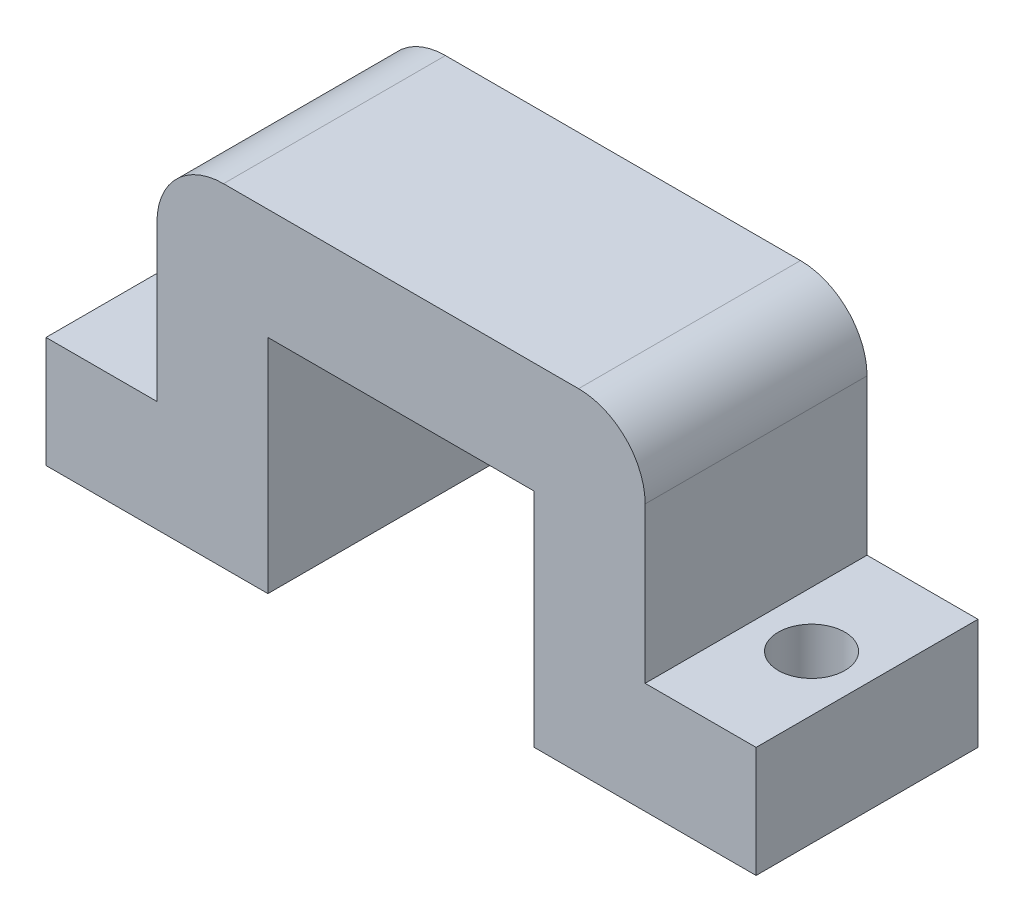
ISO-10303-21;
HEADER;
FILE_DESCRIPTION(('STEP AP214'),'2;1');
FILE_NAME('part.step','',(''),(''),'','','');
FILE_SCHEMA(('AUTOMOTIVE_DESIGN { 1 0 10303 214 1 1 1 1 }'));
ENDSEC;
DATA;
#1=APPLICATION_CONTEXT('core data for automotive mechanical design processes');
#2=APPLICATION_PROTOCOL_DEFINITION('international standard','automotive_design',2000,#1);
#3=PRODUCT_CONTEXT('',#1,'mechanical');
#4=PRODUCT('Part','Part','',(#3));
#5=PRODUCT_RELATED_PRODUCT_CATEGORY('part','',(#4));
#6=PRODUCT_DEFINITION_FORMATION('','',#4);
#7=PRODUCT_DEFINITION_CONTEXT('part definition',#1,'design');
#8=PRODUCT_DEFINITION('design','',#6,#7);
#9=PRODUCT_DEFINITION_SHAPE('','',#8);
#10=(LENGTH_UNIT() NAMED_UNIT(*) SI_UNIT(.MILLI.,.METRE.));
#11=(NAMED_UNIT(*) PLANE_ANGLE_UNIT() SI_UNIT($,.RADIAN.));
#12=(NAMED_UNIT(*) SI_UNIT($,.STERADIAN.) SOLID_ANGLE_UNIT());
#13=UNCERTAINTY_MEASURE_WITH_UNIT(LENGTH_MEASURE(1.E-05),#10,'distance_accuracy_value','');
#14=(GEOMETRIC_REPRESENTATION_CONTEXT(3) GLOBAL_UNCERTAINTY_ASSIGNED_CONTEXT((#13)) GLOBAL_UNIT_ASSIGNED_CONTEXT((#10,
#11,#12)) REPRESENTATION_CONTEXT('',''));
#15=CARTESIAN_POINT('',(0.,0.,0.));
#16=DIRECTION('',(0.,0.,1.));
#17=DIRECTION('',(1.,0.,0.));
#18=AXIS2_PLACEMENT_3D('',#15,#16,#17);
#19=CARTESIAN_POINT('',(0.,1.37362637362637,10.));
#20=DIRECTION('',(0.,1.,0.));
#21=DIRECTION('',(-1.,0.,0.));
#22=AXIS2_PLACEMENT_3D('',#19,#20,#21);
#23=PLANE('',#22);
#24=CARTESIAN_POINT('',(-7.5,1.37362637362637,5.));
#25=DIRECTION('',(0.,1.,0.));
#26=DIRECTION('',(-1.,0.,0.));
#27=AXIS2_PLACEMENT_3D('',#24,#25,#26);
#28=CIRCLE('',#27,1.5);
#29=CARTESIAN_POINT('',(-9.,1.37362637362637,5.));
#30=VERTEX_POINT('',#29);
#31=EDGE_CURVE('E294',#30,#30,#28,.T.);
#32=ORIENTED_EDGE('',*,*,#31,.T.);
#33=EDGE_LOOP('',(#32));
#34=FACE_BOUND('',#33,.T.);
#35=DIRECTION('',(1.,0.,0.));
#36=VECTOR('',#35,1.);
#37=CARTESIAN_POINT('',(0.,1.37362637362637,0.));
#38=LINE('',#37,#36);
#39=CARTESIAN_POINT('',(-10.,1.37362637362637,0.));
#40=VERTEX_POINT('',#39);
#41=CARTESIAN_POINT('',(0.,1.37362637362637,0.));
#42=VERTEX_POINT('',#41);
#43=EDGE_CURVE('E171',#40,#42,#38,.T.);
#44=ORIENTED_EDGE('',*,*,#43,.T.);
#45=DIRECTION('',(0.,0.,-1.));
#46=VECTOR('',#45,1.);
#47=CARTESIAN_POINT('',(0.,1.37362637362637,10.));
#48=LINE('',#47,#46);
#49=CARTESIAN_POINT('',(0.,1.37362637362637,10.));
#50=VERTEX_POINT('',#49);
#51=EDGE_CURVE('E11',#50,#42,#48,.T.);
#52=ORIENTED_EDGE('',*,*,#51,.F.);
#53=DIRECTION('',(1.,0.,0.));
#54=VECTOR('',#53,1.);
#55=CARTESIAN_POINT('',(0.,1.37362637362637,10.));
#56=LINE('',#55,#54);
#57=CARTESIAN_POINT('',(-10.,1.37362637362637,10.));
#58=VERTEX_POINT('',#57);
#59=EDGE_CURVE('E198',#58,#50,#56,.T.);
#60=ORIENTED_EDGE('',*,*,#59,.F.);
#61=DIRECTION('',(0.,0.,-1.));
#62=VECTOR('',#61,1.);
#63=CARTESIAN_POINT('',(-10.,1.37362637362637,10.));
#64=LINE('',#63,#62);
#65=EDGE_CURVE('E167',#58,#40,#64,.T.);
#66=ORIENTED_EDGE('',*,*,#65,.T.);
#67=EDGE_LOOP('',(#44,#52,#60,#66));
#68=FACE_BOUND('',#67,.T.);
#69=ADVANCED_FACE('F39',(#34,#68),#23,.F.);
#70=CARTESIAN_POINT('',(0.,1.37362637362637,10.));
#71=DIRECTION('',(-1.,0.,0.));
#72=DIRECTION('',(0.,0.,1.));
#73=AXIS2_PLACEMENT_3D('',#70,#71,#72);
#74=PLANE('',#73);
#75=DIRECTION('',(0.,1.,0.));
#76=VECTOR('',#75,1.);
#77=CARTESIAN_POINT('',(0.,1.37362637362637,0.));
#78=LINE('',#77,#76);
#79=CARTESIAN_POINT('',(0.,11.3736263736264,0.));
#80=VERTEX_POINT('',#79);
#81=EDGE_CURVE('E174',#42,#80,#78,.T.);
#82=ORIENTED_EDGE('',*,*,#81,.T.);
#83=DIRECTION('',(0.,0.,-1.));
#84=VECTOR('',#83,1.);
#85=CARTESIAN_POINT('',(0.,11.3736263736264,10.));
#86=LINE('',#85,#84);
#87=CARTESIAN_POINT('',(0.,11.3736263736264,10.));
#88=VERTEX_POINT('',#87);
#89=EDGE_CURVE('E47',#88,#80,#86,.T.);
#90=ORIENTED_EDGE('',*,*,#89,.F.);
#91=DIRECTION('',(0.,1.,0.));
#92=VECTOR('',#91,1.);
#93=CARTESIAN_POINT('',(0.,1.37362637362637,10.));
#94=LINE('',#93,#92);
#95=EDGE_CURVE('E116',#50,#88,#94,.T.);
#96=ORIENTED_EDGE('',*,*,#95,.F.);
#97=ORIENTED_EDGE('',*,*,#51,.T.);
#98=EDGE_LOOP('',(#82,#90,#96,#97));
#99=FACE_BOUND('',#98,.T.);
#100=ADVANCED_FACE('F287',(#99),#74,.F.);
#101=CARTESIAN_POINT('',(0.,11.3736263736264,10.));
#102=DIRECTION('',(0.,1.,0.));
#103=DIRECTION('',(0.,0.,1.));
#104=AXIS2_PLACEMENT_3D('',#101,#102,#103);
#105=PLANE('',#104);
#106=DIRECTION('',(1.,0.,0.));
#107=VECTOR('',#106,1.);
#108=CARTESIAN_POINT('',(0.,11.3736263736264,0.));
#109=LINE('',#108,#107);
#110=CARTESIAN_POINT('',(12.,11.3736263736264,0.));
#111=VERTEX_POINT('',#110);
#112=EDGE_CURVE('E177',#80,#111,#109,.T.);
#113=ORIENTED_EDGE('',*,*,#112,.T.);
#114=DIRECTION('',(0.,0.,-1.));
#115=VECTOR('',#114,1.);
#116=CARTESIAN_POINT('',(12.,11.3736263736264,10.));
#117=LINE('',#116,#115);
#118=CARTESIAN_POINT('',(12.,11.3736263736264,10.));
#119=VERTEX_POINT('',#118);
#120=EDGE_CURVE('E223',#119,#111,#117,.T.);
#121=ORIENTED_EDGE('',*,*,#120,.F.);
#122=DIRECTION('',(1.,0.,0.));
#123=VECTOR('',#122,1.);
#124=CARTESIAN_POINT('',(0.,11.3736263736264,10.));
#125=LINE('',#124,#123);
#126=EDGE_CURVE('E231',#88,#119,#125,.T.);
#127=ORIENTED_EDGE('',*,*,#126,.F.);
#128=ORIENTED_EDGE('',*,*,#89,.T.);
#129=EDGE_LOOP('',(#113,#121,#127,#128));
#130=FACE_BOUND('',#129,.T.);
#131=ADVANCED_FACE('F229',(#130),#105,.F.);
#132=CARTESIAN_POINT('',(12.,11.3736263736264,10.));
#133=DIRECTION('',(1.,0.,0.));
#134=DIRECTION('',(0.,1.,0.));
#135=AXIS2_PLACEMENT_3D('',#132,#133,#134);
#136=PLANE('',#135);
#137=DIRECTION('',(0.,-1.,0.));
#138=VECTOR('',#137,1.);
#139=CARTESIAN_POINT('',(12.,11.3736263736264,0.));
#140=LINE('',#139,#138);
#141=CARTESIAN_POINT('',(12.,1.37362637362637,0.));
#142=VERTEX_POINT('',#141);
#143=EDGE_CURVE('E179',#111,#142,#140,.T.);
#144=ORIENTED_EDGE('',*,*,#143,.T.);
#145=DIRECTION('',(0.,0.,-1.));
#146=VECTOR('',#145,1.);
#147=CARTESIAN_POINT('',(12.,1.37362637362637,10.));
#148=LINE('',#147,#146);
#149=CARTESIAN_POINT('',(12.,1.37362637362637,10.));
#150=VERTEX_POINT('',#149);
#151=EDGE_CURVE('E220',#150,#142,#148,.T.);
#152=ORIENTED_EDGE('',*,*,#151,.F.);
#153=DIRECTION('',(0.,-1.,0.));
#154=VECTOR('',#153,1.);
#155=CARTESIAN_POINT('',(12.,11.3736263736264,10.));
#156=LINE('',#155,#154);
#157=EDGE_CURVE('E249',#119,#150,#156,.T.);
#158=ORIENTED_EDGE('',*,*,#157,.F.);
#159=ORIENTED_EDGE('',*,*,#120,.T.);
#160=EDGE_LOOP('',(#144,#152,#158,#159));
#161=FACE_BOUND('',#160,.T.);
#162=ADVANCED_FACE('F240',(#161),#136,.F.);
#163=CARTESIAN_POINT('',(12.,1.37362637362637,10.));
#164=DIRECTION('',(0.,1.,0.));
#165=DIRECTION('',(0.,0.,1.));
#166=AXIS2_PLACEMENT_3D('',#163,#164,#165);
#167=PLANE('',#166);
#168=CARTESIAN_POINT('',(19.5,1.37362637362637,5.));
#169=DIRECTION('',(0.,1.,0.));
#170=DIRECTION('',(0.,0.,1.));
#171=AXIS2_PLACEMENT_3D('',#168,#169,#170);
#172=CIRCLE('',#171,1.5);
#173=CARTESIAN_POINT('',(19.5,1.37362637362637,6.5));
#174=VERTEX_POINT('',#173);
#175=EDGE_CURVE('E175',#174,#174,#172,.F.);
#176=ORIENTED_EDGE('',*,*,#175,.F.);
#177=EDGE_LOOP('',(#176));
#178=FACE_BOUND('',#177,.T.);
#179=DIRECTION('',(1.,0.,0.));
#180=VECTOR('',#179,1.);
#181=CARTESIAN_POINT('',(12.,1.37362637362637,0.));
#182=LINE('',#181,#180);
#183=CARTESIAN_POINT('',(22.,1.37362637362637,0.));
#184=VERTEX_POINT('',#183);
#185=EDGE_CURVE('E181',#142,#184,#182,.T.);
#186=ORIENTED_EDGE('',*,*,#185,.T.);
#187=DIRECTION('',(0.,0.,-1.));
#188=VECTOR('',#187,1.);
#189=CARTESIAN_POINT('',(22.,1.37362637362637,10.));
#190=LINE('',#189,#188);
#191=CARTESIAN_POINT('',(22.,1.37362637362637,10.));
#192=VERTEX_POINT('',#191);
#193=EDGE_CURVE('E217',#192,#184,#190,.T.);
#194=ORIENTED_EDGE('',*,*,#193,.F.);
#195=DIRECTION('',(1.,0.,0.));
#196=VECTOR('',#195,1.);
#197=CARTESIAN_POINT('',(12.,1.37362637362637,10.));
#198=LINE('',#197,#196);
#199=EDGE_CURVE('E246',#150,#192,#198,.T.);
#200=ORIENTED_EDGE('',*,*,#199,.F.);
#201=ORIENTED_EDGE('',*,*,#151,.T.);
#202=EDGE_LOOP('',(#186,#194,#200,#201));
#203=FACE_BOUND('',#202,.T.);
#204=ADVANCED_FACE('F244',(#178,#203),#167,.F.);
#205=CARTESIAN_POINT('',(22.,6.37362637362637,10.));
#206=DIRECTION('',(-1.,0.,0.));
#207=DIRECTION('',(0.,0.,1.));
#208=AXIS2_PLACEMENT_3D('',#205,#206,#207);
#209=PLANE('',#208);
#210=DIRECTION('',(0.,1.,0.));
#211=VECTOR('',#210,1.);
#212=CARTESIAN_POINT('',(22.,6.37362637362637,0.));
#213=LINE('',#212,#211);
#214=CARTESIAN_POINT('',(22.,6.37362637362637,0.));
#215=VERTEX_POINT('',#214);
#216=EDGE_CURVE('E183',#184,#215,#213,.T.);
#217=ORIENTED_EDGE('',*,*,#216,.T.);
#218=DIRECTION('',(0.,0.,-1.));
#219=VECTOR('',#218,1.);
#220=CARTESIAN_POINT('',(22.,6.37362637362637,10.));
#221=LINE('',#220,#219);
#222=CARTESIAN_POINT('',(22.,6.37362637362637,10.));
#223=VERTEX_POINT('',#222);
#224=EDGE_CURVE('E214',#223,#215,#221,.T.);
#225=ORIENTED_EDGE('',*,*,#224,.F.);
#226=DIRECTION('',(0.,1.,0.));
#227=VECTOR('',#226,1.);
#228=CARTESIAN_POINT('',(22.,6.37362637362637,10.));
#229=LINE('',#228,#227);
#230=EDGE_CURVE('E248',#192,#223,#229,.T.);
#231=ORIENTED_EDGE('',*,*,#230,.F.);
#232=ORIENTED_EDGE('',*,*,#193,.T.);
#233=EDGE_LOOP('',(#217,#225,#231,#232));
#234=FACE_BOUND('',#233,.T.);
#235=ADVANCED_FACE('F320',(#234),#209,.F.);
#236=CARTESIAN_POINT('',(17.,6.37362637362637,10.));
#237=DIRECTION('',(0.,-1.,0.));
#238=DIRECTION('',(0.,0.,-1.));
#239=AXIS2_PLACEMENT_3D('',#236,#237,#238);
#240=PLANE('',#239);
#241=CARTESIAN_POINT('',(19.5,6.37362637362637,5.));
#242=DIRECTION('',(0.,1.,0.));
#243=DIRECTION('',(0.,0.,1.));
#244=AXIS2_PLACEMENT_3D('',#241,#242,#243);
#245=CIRCLE('',#244,1.5);
#246=CARTESIAN_POINT('',(19.5,6.37362637362637,6.5));
#247=VERTEX_POINT('',#246);
#248=EDGE_CURVE('E301',#247,#247,#245,.F.);
#249=ORIENTED_EDGE('',*,*,#248,.T.);
#250=EDGE_LOOP('',(#249));
#251=FACE_BOUND('',#250,.T.);
#252=DIRECTION('',(-1.,0.,0.));
#253=VECTOR('',#252,1.);
#254=CARTESIAN_POINT('',(17.,6.37362637362637,0.));
#255=LINE('',#254,#253);
#256=CARTESIAN_POINT('',(17.,6.37362637362637,0.));
#257=VERTEX_POINT('',#256);
#258=EDGE_CURVE('E185',#215,#257,#255,.T.);
#259=ORIENTED_EDGE('',*,*,#258,.T.);
#260=DIRECTION('',(0.,0.,-1.));
#261=VECTOR('',#260,1.);
#262=CARTESIAN_POINT('',(17.,6.37362637362637,10.));
#263=LINE('',#262,#261);
#264=CARTESIAN_POINT('',(17.,6.37362637362637,10.));
#265=VERTEX_POINT('',#264);
#266=EDGE_CURVE('E211',#265,#257,#263,.T.);
#267=ORIENTED_EDGE('',*,*,#266,.F.);
#268=DIRECTION('',(-1.,0.,0.));
#269=VECTOR('',#268,1.);
#270=CARTESIAN_POINT('',(17.,6.37362637362637,10.));
#271=LINE('',#270,#269);
#272=EDGE_CURVE('E251',#223,#265,#271,.T.);
#273=ORIENTED_EDGE('',*,*,#272,.F.);
#274=ORIENTED_EDGE('',*,*,#224,.T.);
#275=EDGE_LOOP('',(#259,#267,#273,#274));
#276=FACE_BOUND('',#275,.T.);
#277=ADVANCED_FACE('F309',(#251,#276),#240,.F.);
#278=CARTESIAN_POINT('',(17.,13.3736263736264,10.));
#279=DIRECTION('',(-1.,0.,0.));
#280=DIRECTION('',(0.,0.,1.));
#281=AXIS2_PLACEMENT_3D('',#278,#279,#280);
#282=PLANE('',#281);
#283=DIRECTION('',(0.,1.,0.));
#284=VECTOR('',#283,1.);
#285=CARTESIAN_POINT('',(17.,13.3736263736264,0.));
#286=LINE('',#285,#284);
#287=CARTESIAN_POINT('',(17.,13.3736263736264,0.));
#288=VERTEX_POINT('',#287);
#289=EDGE_CURVE('E187',#257,#288,#286,.T.);
#290=ORIENTED_EDGE('',*,*,#289,.T.);
#291=DIRECTION('',(0.,0.,-1.));
#292=VECTOR('',#291,1.);
#293=CARTESIAN_POINT('',(17.,13.3736263736264,10.));
#294=LINE('',#293,#292);
#295=CARTESIAN_POINT('',(17.,13.3736263736264,10.));
#296=VERTEX_POINT('',#295);
#297=EDGE_CURVE('E208',#296,#288,#294,.T.);
#298=ORIENTED_EDGE('',*,*,#297,.F.);
#299=DIRECTION('',(0.,1.,0.));
#300=VECTOR('',#299,1.);
#301=CARTESIAN_POINT('',(17.,13.3736263736264,10.));
#302=LINE('',#301,#300);
#303=EDGE_CURVE('E257',#265,#296,#302,.T.);
#304=ORIENTED_EDGE('',*,*,#303,.F.);
#305=ORIENTED_EDGE('',*,*,#266,.T.);
#306=EDGE_LOOP('',(#290,#298,#304,#305));
#307=FACE_BOUND('',#306,.T.);
#308=ADVANCED_FACE('F354',(#307),#282,.F.);
#309=CARTESIAN_POINT('',(14.,13.3736263736264,10.));
#310=DIRECTION('',(0.,0.,-1.));
#311=DIRECTION('',(-1.,0.,0.));
#312=AXIS2_PLACEMENT_3D('',#309,#310,#311);
#313=CYLINDRICAL_SURFACE('',#312,3.);
#314=CARTESIAN_POINT('',(14.,13.3736263736264,0.));
#315=DIRECTION('',(0.,0.,1.));
#316=DIRECTION('',(1.,0.,0.));
#317=AXIS2_PLACEMENT_3D('',#314,#315,#316);
#318=CIRCLE('',#317,3.);
#319=CARTESIAN_POINT('',(14.,16.3736263736264,0.));
#320=VERTEX_POINT('',#319);
#321=EDGE_CURVE('E189',#288,#320,#318,.T.);
#322=ORIENTED_EDGE('',*,*,#321,.T.);
#323=DIRECTION('',(0.,0.,-1.));
#324=VECTOR('',#323,1.);
#325=CARTESIAN_POINT('',(14.,16.3736263736264,10.));
#326=LINE('',#325,#324);
#327=CARTESIAN_POINT('',(14.,16.3736263736264,10.));
#328=VERTEX_POINT('',#327);
#329=EDGE_CURVE('E205',#328,#320,#326,.T.);
#330=ORIENTED_EDGE('',*,*,#329,.F.);
#331=CARTESIAN_POINT('',(14.,13.3736263736264,10.));
#332=DIRECTION('',(0.,0.,1.));
#333=DIRECTION('',(1.,0.,0.));
#334=AXIS2_PLACEMENT_3D('',#331,#332,#333);
#335=CIRCLE('',#334,3.);
#336=EDGE_CURVE('E259',#296,#328,#335,.T.);
#337=ORIENTED_EDGE('',*,*,#336,.F.);
#338=ORIENTED_EDGE('',*,*,#297,.T.);
#339=EDGE_LOOP('',(#322,#330,#337,#338));
#340=FACE_BOUND('',#339,.T.);
#341=ADVANCED_FACE('F359',(#340),#313,.T.);
#342=CARTESIAN_POINT('',(-1.99999999999998,16.3736263736264,10.));
#343=DIRECTION('',(0.,-1.,0.));
#344=DIRECTION('',(0.,0.,-1.));
#345=AXIS2_PLACEMENT_3D('',#342,#343,#344);
#346=PLANE('',#345);
#347=DIRECTION('',(-1.,0.,0.));
#348=VECTOR('',#347,1.);
#349=CARTESIAN_POINT('',(-1.99999999999998,16.3736263736264,0.));
#350=LINE('',#349,#348);
#351=CARTESIAN_POINT('',(-1.99999999999998,16.3736263736264,0.));
#352=VERTEX_POINT('',#351);
#353=EDGE_CURVE('E191',#320,#352,#350,.T.);
#354=ORIENTED_EDGE('',*,*,#353,.T.);
#355=DIRECTION('',(0.,0.,-1.));
#356=VECTOR('',#355,1.);
#357=CARTESIAN_POINT('',(-1.99999999999998,16.3736263736264,10.));
#358=LINE('',#357,#356);
#359=CARTESIAN_POINT('',(-1.99999999999998,16.3736263736264,10.));
#360=VERTEX_POINT('',#359);
#361=EDGE_CURVE('E202',#360,#352,#358,.T.);
#362=ORIENTED_EDGE('',*,*,#361,.F.);
#363=DIRECTION('',(-1.,0.,0.));
#364=VECTOR('',#363,1.);
#365=CARTESIAN_POINT('',(-1.99999999999998,16.3736263736264,10.));
#366=LINE('',#365,#364);
#367=EDGE_CURVE('E261',#328,#360,#366,.T.);
#368=ORIENTED_EDGE('',*,*,#367,.F.);
#369=ORIENTED_EDGE('',*,*,#329,.T.);
#370=EDGE_LOOP('',(#354,#362,#368,#369));
#371=FACE_BOUND('',#370,.T.);
#372=ADVANCED_FACE('F267',(#371),#346,.F.);
#373=CARTESIAN_POINT('',(-2.,13.3736263736264,10.));
#374=DIRECTION('',(0.,0.,-1.));
#375=DIRECTION('',(-1.,0.,0.));
#376=AXIS2_PLACEMENT_3D('',#373,#374,#375);
#377=CYLINDRICAL_SURFACE('',#376,3.);
#378=CARTESIAN_POINT('',(-2.,13.3736263736264,0.));
#379=DIRECTION('',(0.,0.,1.));
#380=DIRECTION('',(1.,0.,0.));
#381=AXIS2_PLACEMENT_3D('',#378,#379,#380);
#382=CIRCLE('',#381,3.);
#383=CARTESIAN_POINT('',(-5.,13.3736263736264,0.));
#384=VERTEX_POINT('',#383);
#385=EDGE_CURVE('E193',#352,#384,#382,.T.);
#386=ORIENTED_EDGE('',*,*,#385,.T.);
#387=DIRECTION('',(0.,0.,-1.));
#388=VECTOR('',#387,1.);
#389=CARTESIAN_POINT('',(-5.,13.3736263736264,10.));
#390=LINE('',#389,#388);
#391=CARTESIAN_POINT('',(-5.,13.3736263736264,10.));
#392=VERTEX_POINT('',#391);
#393=EDGE_CURVE('E162',#392,#384,#390,.T.);
#394=ORIENTED_EDGE('',*,*,#393,.F.);
#395=CARTESIAN_POINT('',(-2.,13.3736263736264,10.));
#396=DIRECTION('',(0.,0.,1.));
#397=DIRECTION('',(1.,0.,0.));
#398=AXIS2_PLACEMENT_3D('',#395,#396,#397);
#399=CIRCLE('',#398,3.);
#400=EDGE_CURVE('E153',#360,#392,#399,.T.);
#401=ORIENTED_EDGE('',*,*,#400,.F.);
#402=ORIENTED_EDGE('',*,*,#361,.T.);
#403=EDGE_LOOP('',(#386,#394,#401,#402));
#404=FACE_BOUND('',#403,.T.);
#405=ADVANCED_FACE('F271',(#404),#377,.T.);
#406=CARTESIAN_POINT('',(-5.,6.37362637362637,10.));
#407=DIRECTION('',(1.,0.,0.));
#408=DIRECTION('',(0.,0.,-1.));
#409=AXIS2_PLACEMENT_3D('',#406,#407,#408);
#410=PLANE('',#409);
#411=DIRECTION('',(0.,-1.,0.));
#412=VECTOR('',#411,1.);
#413=CARTESIAN_POINT('',(-5.,6.37362637362637,0.));
#414=LINE('',#413,#412);
#415=CARTESIAN_POINT('',(-5.,6.37362637362637,0.));
#416=VERTEX_POINT('',#415);
#417=EDGE_CURVE('E161',#384,#416,#414,.T.);
#418=ORIENTED_EDGE('',*,*,#417,.T.);
#419=DIRECTION('',(0.,0.,-1.));
#420=VECTOR('',#419,1.);
#421=CARTESIAN_POINT('',(-5.,6.37362637362637,10.));
#422=LINE('',#421,#420);
#423=CARTESIAN_POINT('',(-5.,6.37362637362637,10.));
#424=VERTEX_POINT('',#423);
#425=EDGE_CURVE('E158',#424,#416,#422,.T.);
#426=ORIENTED_EDGE('',*,*,#425,.F.);
#427=DIRECTION('',(0.,-1.,0.));
#428=VECTOR('',#427,1.);
#429=CARTESIAN_POINT('',(-5.,6.37362637362637,10.));
#430=LINE('',#429,#428);
#431=EDGE_CURVE('E147',#392,#424,#430,.T.);
#432=ORIENTED_EDGE('',*,*,#431,.F.);
#433=ORIENTED_EDGE('',*,*,#393,.T.);
#434=EDGE_LOOP('',(#418,#426,#432,#433));
#435=FACE_BOUND('',#434,.T.);
#436=ADVANCED_FACE('F159',(#435),#410,.F.);
#437=CARTESIAN_POINT('',(-5.,6.37362637362637,10.));
#438=DIRECTION('',(0.,-1.,0.));
#439=DIRECTION('',(0.,0.,-1.));
#440=AXIS2_PLACEMENT_3D('',#437,#438,#439);
#441=PLANE('',#440);
#442=CARTESIAN_POINT('',(-7.5,6.37362637362637,5.));
#443=DIRECTION('',(0.,1.,0.));
#444=DIRECTION('',(0.,0.,1.));
#445=AXIS2_PLACEMENT_3D('',#442,#443,#444);
#446=CIRCLE('',#445,1.5);
#447=CARTESIAN_POINT('',(-7.5,6.37362637362637,6.5));
#448=VERTEX_POINT('',#447);
#449=EDGE_CURVE('E296',#448,#448,#446,.T.);
#450=ORIENTED_EDGE('',*,*,#449,.F.);
#451=EDGE_LOOP('',(#450));
#452=FACE_BOUND('',#451,.T.);
#453=DIRECTION('',(-1.,0.,0.));
#454=VECTOR('',#453,1.);
#455=CARTESIAN_POINT('',(-5.,6.37362637362637,0.));
#456=LINE('',#455,#454);
#457=CARTESIAN_POINT('',(-10.,6.37362637362637,0.));
#458=VERTEX_POINT('',#457);
#459=EDGE_CURVE('E102',#416,#458,#456,.T.);
#460=ORIENTED_EDGE('',*,*,#459,.T.);
#461=DIRECTION('',(0.,0.,-1.));
#462=VECTOR('',#461,1.);
#463=CARTESIAN_POINT('',(-10.,6.37362637362637,10.));
#464=LINE('',#463,#462);
#465=CARTESIAN_POINT('',(-10.,6.37362637362637,10.));
#466=VERTEX_POINT('',#465);
#467=EDGE_CURVE('E163',#466,#458,#464,.T.);
#468=ORIENTED_EDGE('',*,*,#467,.F.);
#469=DIRECTION('',(-1.,0.,0.));
#470=VECTOR('',#469,1.);
#471=CARTESIAN_POINT('',(-5.,6.37362637362637,10.));
#472=LINE('',#471,#470);
#473=EDGE_CURVE('E151',#424,#466,#472,.T.);
#474=ORIENTED_EDGE('',*,*,#473,.F.);
#475=ORIENTED_EDGE('',*,*,#425,.T.);
#476=EDGE_LOOP('',(#460,#468,#474,#475));
#477=FACE_BOUND('',#476,.T.);
#478=ADVANCED_FACE('F165',(#452,#477),#441,.F.);
#479=CARTESIAN_POINT('',(-10.,6.37362637362637,10.));
#480=DIRECTION('',(1.,0.,0.));
#481=DIRECTION('',(0.,0.,-1.));
#482=AXIS2_PLACEMENT_3D('',#479,#480,#481);
#483=PLANE('',#482);
#484=DIRECTION('',(0.,-1.,0.));
#485=VECTOR('',#484,1.);
#486=CARTESIAN_POINT('',(-10.,6.37362637362637,0.));
#487=LINE('',#486,#485);
#488=EDGE_CURVE('E108',#458,#40,#487,.T.);
#489=ORIENTED_EDGE('',*,*,#488,.T.);
#490=ORIENTED_EDGE('',*,*,#65,.F.);
#491=DIRECTION('',(0.,-1.,0.));
#492=VECTOR('',#491,1.);
#493=CARTESIAN_POINT('',(-10.,6.37362637362637,10.));
#494=LINE('',#493,#492);
#495=EDGE_CURVE('E55',#466,#58,#494,.T.);
#496=ORIENTED_EDGE('',*,*,#495,.F.);
#497=ORIENTED_EDGE('',*,*,#467,.T.);
#498=EDGE_LOOP('',(#489,#490,#496,#497));
#499=FACE_BOUND('',#498,.T.);
#500=ADVANCED_FACE('F275',(#499),#483,.F.);
#501=CARTESIAN_POINT('',(-2.,13.3736263736264,10.));
#502=DIRECTION('',(0.,0.,1.));
#503=DIRECTION('',(1.,0.,0.));
#504=AXIS2_PLACEMENT_3D('',#501,#502,#503);
#505=PLANE('',#504);
#506=ORIENTED_EDGE('',*,*,#59,.T.);
#507=ORIENTED_EDGE('',*,*,#95,.T.);
#508=ORIENTED_EDGE('',*,*,#126,.T.);
#509=ORIENTED_EDGE('',*,*,#157,.T.);
#510=ORIENTED_EDGE('',*,*,#199,.T.);
#511=ORIENTED_EDGE('',*,*,#230,.T.);
#512=ORIENTED_EDGE('',*,*,#272,.T.);
#513=ORIENTED_EDGE('',*,*,#303,.T.);
#514=ORIENTED_EDGE('',*,*,#336,.T.);
#515=ORIENTED_EDGE('',*,*,#367,.T.);
#516=ORIENTED_EDGE('',*,*,#400,.T.);
#517=ORIENTED_EDGE('',*,*,#431,.T.);
#518=ORIENTED_EDGE('',*,*,#473,.T.);
#519=ORIENTED_EDGE('',*,*,#495,.T.);
#520=EDGE_LOOP('',(#506,#507,#508,#509,#510,#511,#512,#513,#514,#515,#516,#517,#518,#519));
#521=FACE_BOUND('',#520,.T.);
#522=ADVANCED_FACE('F149',(#521),#505,.T.);
#523=CARTESIAN_POINT('',(-2.,13.3736263736264,0.));
#524=DIRECTION('',(0.,0.,1.));
#525=DIRECTION('',(1.,0.,0.));
#526=AXIS2_PLACEMENT_3D('',#523,#524,#525);
#527=PLANE('',#526);
#528=ORIENTED_EDGE('',*,*,#43,.F.);
#529=ORIENTED_EDGE('',*,*,#488,.F.);
#530=ORIENTED_EDGE('',*,*,#459,.F.);
#531=ORIENTED_EDGE('',*,*,#417,.F.);
#532=ORIENTED_EDGE('',*,*,#385,.F.);
#533=ORIENTED_EDGE('',*,*,#353,.F.);
#534=ORIENTED_EDGE('',*,*,#321,.F.);
#535=ORIENTED_EDGE('',*,*,#289,.F.);
#536=ORIENTED_EDGE('',*,*,#258,.F.);
#537=ORIENTED_EDGE('',*,*,#216,.F.);
#538=ORIENTED_EDGE('',*,*,#185,.F.);
#539=ORIENTED_EDGE('',*,*,#143,.F.);
#540=ORIENTED_EDGE('',*,*,#112,.F.);
#541=ORIENTED_EDGE('',*,*,#81,.F.);
#542=EDGE_LOOP('',(#528,#529,#530,#531,#532,#533,#534,#535,#536,#537,#538,#539,#540,#541));
#543=FACE_BOUND('',#542,.T.);
#544=ADVANCED_FACE('F235',(#543),#527,.F.);
#545=CARTESIAN_POINT('',(-7.5,-13.6263736263736,5.));
#546=DIRECTION('',(0.,1.,0.));
#547=DIRECTION('',(0.,0.,1.));
#548=AXIS2_PLACEMENT_3D('',#545,#546,#547);
#549=CYLINDRICAL_SURFACE('',#548,1.5);
#550=ORIENTED_EDGE('',*,*,#449,.T.);
#551=EDGE_LOOP('',(#550));
#552=FACE_BOUND('',#551,.T.);
#553=ORIENTED_EDGE('',*,*,#31,.F.);
#554=EDGE_LOOP('',(#553));
#555=FACE_BOUND('',#554,.T.);
#556=ADVANCED_FACE('F315',(#552,#555),#549,.F.);
#557=CARTESIAN_POINT('',(19.5,-13.6263736263736,5.));
#558=DIRECTION('',(0.,1.,0.));
#559=DIRECTION('',(0.,0.,1.));
#560=AXIS2_PLACEMENT_3D('',#557,#558,#559);
#561=CYLINDRICAL_SURFACE('',#560,1.5);
#562=ORIENTED_EDGE('',*,*,#248,.F.);
#563=EDGE_LOOP('',(#562));
#564=FACE_BOUND('',#563,.T.);
#565=ORIENTED_EDGE('',*,*,#175,.T.);
#566=EDGE_LOOP('',(#565));
#567=FACE_BOUND('',#566,.T.);
#568=ADVANCED_FACE('F312',(#564,#567),#561,.F.);
#569=CLOSED_SHELL('',(#69,#100,#131,#162,#204,#235,#277,#308,#341,#372,#405,#436,#478,#500,#522,
#544,#556,#568));
#570=MANIFOLD_SOLID_BREP('B2',#569);
#571=ADVANCED_BREP_SHAPE_REPRESENTATION('',(#18,#570),#14);
#572=SHAPE_DEFINITION_REPRESENTATION(#9,#571);
ENDSEC;
END-ISO-10303-21;
